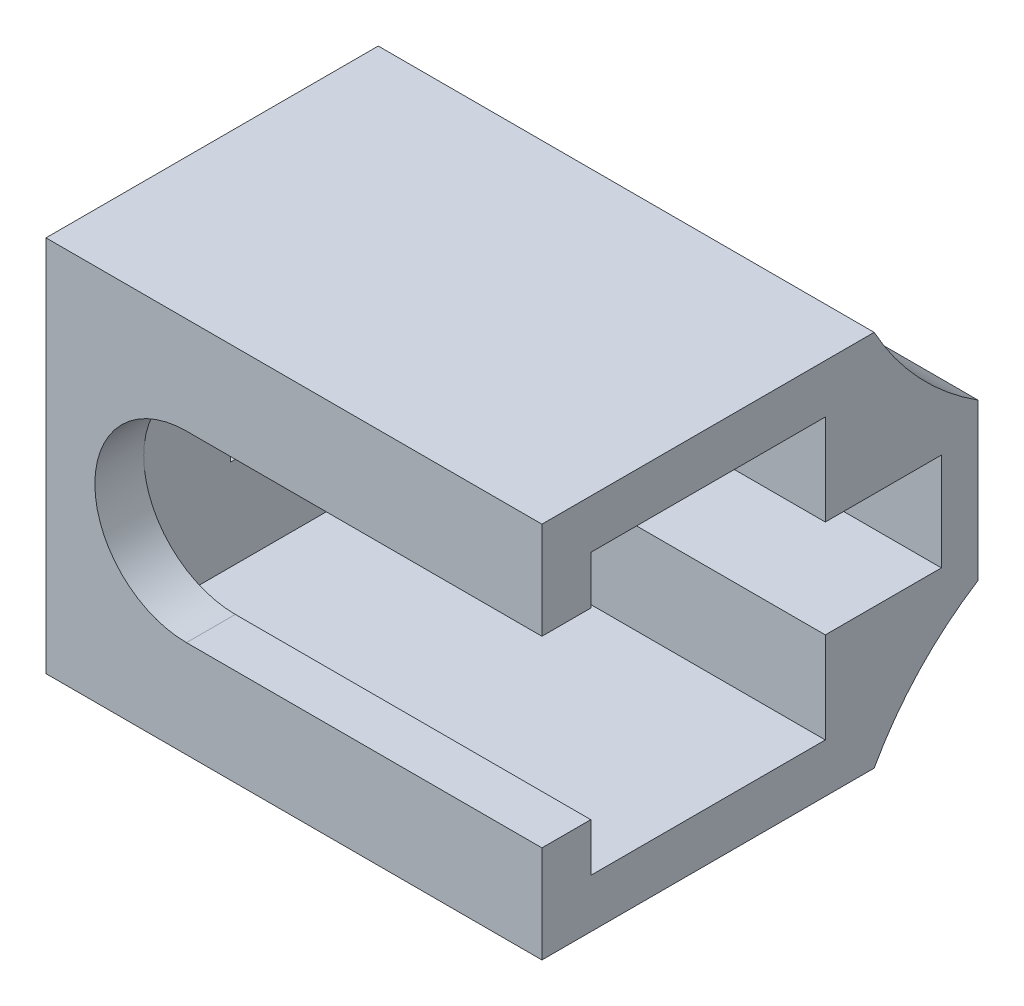
ISO-10303-21;
HEADER;
FILE_DESCRIPTION(('STEP AP214'),'2;1');
FILE_NAME('part.step','',(''),(''),'','','');
FILE_SCHEMA(('AUTOMOTIVE_DESIGN { 1 0 10303 214 1 1 1 1 }'));
ENDSEC;
DATA;
#1=APPLICATION_CONTEXT('core data for automotive mechanical design processes');
#2=APPLICATION_PROTOCOL_DEFINITION('international standard','automotive_design',2000,#1);
#3=PRODUCT_CONTEXT('',#1,'mechanical');
#4=PRODUCT('Part','Part','',(#3));
#5=PRODUCT_RELATED_PRODUCT_CATEGORY('part','',(#4));
#6=PRODUCT_DEFINITION_FORMATION('','',#4);
#7=PRODUCT_DEFINITION_CONTEXT('part definition',#1,'design');
#8=PRODUCT_DEFINITION('design','',#6,#7);
#9=PRODUCT_DEFINITION_SHAPE('','',#8);
#10=(LENGTH_UNIT() NAMED_UNIT(*) SI_UNIT(.MILLI.,.METRE.));
#11=(NAMED_UNIT(*) PLANE_ANGLE_UNIT() SI_UNIT($,.RADIAN.));
#12=(NAMED_UNIT(*) SI_UNIT($,.STERADIAN.) SOLID_ANGLE_UNIT());
#13=UNCERTAINTY_MEASURE_WITH_UNIT(LENGTH_MEASURE(1.E-05),#10,'distance_accuracy_value','');
#14=(GEOMETRIC_REPRESENTATION_CONTEXT(3) GLOBAL_UNCERTAINTY_ASSIGNED_CONTEXT((#13)) GLOBAL_UNIT_ASSIGNED_CONTEXT((#10,
#11,#12)) REPRESENTATION_CONTEXT('',''));
#15=CARTESIAN_POINT('',(0.,0.,0.));
#16=DIRECTION('',(0.,0.,1.));
#17=DIRECTION('',(1.,0.,0.));
#18=AXIS2_PLACEMENT_3D('',#15,#16,#17);
#19=CARTESIAN_POINT('',(-57.5,2.5,-45.));
#20=DIRECTION('',(1.,0.,0.));
#21=DIRECTION('',(0.,0.,-1.));
#22=AXIS2_PLACEMENT_3D('',#19,#20,#21);
#23=PLANE('',#22);
#24=DIRECTION('',(0.,0.,-1.));
#25=VECTOR('',#24,1.);
#26=CARTESIAN_POINT('',(-57.5,4.00000000000001,52.1));
#27=LINE('',#26,#25);
#28=CARTESIAN_POINT('',(-57.5,4.00000000000001,57.1));
#29=VERTEX_POINT('',#28);
#30=CARTESIAN_POINT('',(-57.5,4.00000000000001,52.1));
#31=VERTEX_POINT('',#30);
#32=EDGE_CURVE('E294',#29,#31,#27,.T.);
#33=ORIENTED_EDGE('',*,*,#32,.F.);
#34=DIRECTION('',(0.,1.,0.));
#35=VECTOR('',#34,1.);
#36=CARTESIAN_POINT('',(-57.5,4.00000000000001,57.1));
#37=LINE('',#36,#35);
#38=CARTESIAN_POINT('',(-57.5,-3.99999999999999,57.1));
#39=VERTEX_POINT('',#38);
#40=EDGE_CURVE('E291',#39,#29,#37,.T.);
#41=ORIENTED_EDGE('',*,*,#40,.F.);
#42=DIRECTION('',(0.,0.,1.));
#43=VECTOR('',#42,1.);
#44=CARTESIAN_POINT('',(-57.5,-3.99999999999999,52.1));
#45=LINE('',#44,#43);
#46=CARTESIAN_POINT('',(-57.5,-3.99999999999999,52.1));
#47=VERTEX_POINT('',#46);
#48=EDGE_CURVE('E302',#47,#39,#45,.T.);
#49=ORIENTED_EDGE('',*,*,#48,.F.);
#50=DIRECTION('',(0.,-1.,0.));
#51=VECTOR('',#50,1.);
#52=CARTESIAN_POINT('',(-57.5,4.00000000000001,52.1));
#53=LINE('',#52,#51);
#54=EDGE_CURVE('E298',#31,#47,#53,.T.);
#55=ORIENTED_EDGE('',*,*,#54,.F.);
#56=EDGE_LOOP('',(#33,#41,#49,#55));
#57=FACE_BOUND('',#56,.T.);
#58=CARTESIAN_POINT('',(-57.5,27.5,19.0957195963894));
#59=DIRECTION('',(1.,0.,0.));
#60=DIRECTION('',(0.,0.,-1.));
#61=AXIS2_PLACEMENT_3D('',#58,#59,#60);
#62=CIRCLE('',#61,25.);
#63=CARTESIAN_POINT('',(-57.5,15.45,41.));
#64=VERTEX_POINT('',#63);
#65=CARTESIAN_POINT('',(-57.5,6.39726873455995,32.5));
#66=VERTEX_POINT('',#65);
#67=EDGE_CURVE('E209',#64,#66,#62,.T.);
#68=ORIENTED_EDGE('',*,*,#67,.T.);
#69=DIRECTION('',(0.,-1.,0.));
#70=VECTOR('',#69,1.);
#71=CARTESIAN_POINT('',(-57.5,15.45,32.5));
#72=LINE('',#71,#70);
#73=CARTESIAN_POINT('',(-57.5,-6.39726873455994,32.5));
#74=VERTEX_POINT('',#73);
#75=EDGE_CURVE('E58',#66,#74,#72,.T.);
#76=ORIENTED_EDGE('',*,*,#75,.T.);
#77=CARTESIAN_POINT('',(-57.5,-27.5,19.0957195963894));
#78=DIRECTION('',(1.,0.,0.));
#79=DIRECTION('',(0.,0.,-1.));
#80=AXIS2_PLACEMENT_3D('',#77,#78,#79);
#81=CIRCLE('',#80,25.);
#82=CARTESIAN_POINT('',(-57.5,-15.45,41.));
#83=VERTEX_POINT('',#82);
#84=EDGE_CURVE('E206',#74,#83,#81,.T.);
#85=ORIENTED_EDGE('',*,*,#84,.T.);
#86=DIRECTION('',(0.,0.,1.));
#87=VECTOR('',#86,1.);
#88=CARTESIAN_POINT('',(-57.5,-15.45,41.));
#89=LINE('',#88,#87);
#90=CARTESIAN_POINT('',(-57.5,-15.45,68.2));
#91=VERTEX_POINT('',#90);
#92=EDGE_CURVE('E388',#83,#91,#89,.T.);
#93=ORIENTED_EDGE('',*,*,#92,.T.);
#94=DIRECTION('',(0.,1.,0.));
#95=VECTOR('',#94,1.);
#96=CARTESIAN_POINT('',(-57.5,15.45,68.2));
#97=LINE('',#96,#95);
#98=CARTESIAN_POINT('',(-57.5,15.45,68.2));
#99=VERTEX_POINT('',#98);
#100=EDGE_CURVE('E377',#91,#99,#97,.T.);
#101=ORIENTED_EDGE('',*,*,#100,.T.);
#102=DIRECTION('',(0.,0.,-1.));
#103=VECTOR('',#102,1.);
#104=CARTESIAN_POINT('',(-57.5,15.45,41.));
#105=LINE('',#104,#103);
#106=EDGE_CURVE('E361',#99,#64,#105,.T.);
#107=ORIENTED_EDGE('',*,*,#106,.T.);
#108=EDGE_LOOP('',(#68,#76,#85,#93,#101,#107));
#109=FACE_BOUND('',#108,.T.);
#110=ADVANCED_FACE('F42',(#57,#109),#23,.F.);
#111=CARTESIAN_POINT('',(-16.9,11.45,64.2));
#112=DIRECTION('',(0.,0.,1.));
#113=DIRECTION('',(1.,0.,0.));
#114=AXIS2_PLACEMENT_3D('',#111,#112,#113);
#115=PLANE('',#114);
#116=CARTESIAN_POINT('',(-46.,0.,64.2));
#117=DIRECTION('',(0.,0.,1.));
#118=DIRECTION('',(1.,0.,0.));
#119=AXIS2_PLACEMENT_3D('',#116,#117,#118);
#120=CIRCLE('',#119,7.5);
#121=CARTESIAN_POINT('',(-46.,-7.5,64.2));
#122=VERTEX_POINT('',#121);
#123=CARTESIAN_POINT('',(-53.5,0.,64.2));
#124=VERTEX_POINT('',#123);
#125=EDGE_CURVE('E682',#122,#124,#120,.F.);
#126=ORIENTED_EDGE('',*,*,#125,.F.);
#127=DIRECTION('',(-1.,0.,0.));
#128=VECTOR('',#127,1.);
#129=CARTESIAN_POINT('',(-46.,-7.5,64.2));
#130=LINE('',#129,#128);
#131=CARTESIAN_POINT('',(-16.9,-7.5,64.2));
#132=VERTEX_POINT('',#131);
#133=EDGE_CURVE('E688',#132,#122,#130,.T.);
#134=ORIENTED_EDGE('',*,*,#133,.F.);
#135=DIRECTION('',(0.,1.,0.));
#136=VECTOR('',#135,1.);
#137=CARTESIAN_POINT('',(-16.9,11.45,64.2));
#138=LINE('',#137,#136);
#139=CARTESIAN_POINT('',(-16.9,-11.45,64.2));
#140=VERTEX_POINT('',#139);
#141=EDGE_CURVE('E348',#140,#132,#138,.T.);
#142=ORIENTED_EDGE('',*,*,#141,.F.);
#143=DIRECTION('',(-1.,0.,0.));
#144=VECTOR('',#143,1.);
#145=CARTESIAN_POINT('',(-16.9,-11.45,64.2));
#146=LINE('',#145,#144);
#147=CARTESIAN_POINT('',(-53.5,-11.45,64.2));
#148=VERTEX_POINT('',#147);
#149=EDGE_CURVE('E366',#140,#148,#146,.T.);
#150=ORIENTED_EDGE('',*,*,#149,.T.);
#151=DIRECTION('',(0.,1.,0.));
#152=VECTOR('',#151,1.);
#153=CARTESIAN_POINT('',(-53.5,-11.45,64.2));
#154=LINE('',#153,#152);
#155=EDGE_CURVE('E331',#148,#124,#154,.T.);
#156=ORIENTED_EDGE('',*,*,#155,.T.);
#157=EDGE_LOOP('',(#126,#134,#142,#150,#156));
#158=FACE_BOUND('',#157,.T.);
#159=ADVANCED_FACE('F422',(#158),#115,.F.);
#160=CARTESIAN_POINT('',(-53.5,0.,0.));
#161=DIRECTION('',(-1.,0.,0.));
#162=DIRECTION('',(0.,0.,1.));
#163=AXIS2_PLACEMENT_3D('',#160,#161,#162);
#164=PLANE('',#163);
#165=DIRECTION('',(0.,-1.,0.));
#166=VECTOR('',#165,1.);
#167=CARTESIAN_POINT('',(-53.5,11.45,45.));
#168=LINE('',#167,#166);
#169=CARTESIAN_POINT('',(-53.5,11.45,45.));
#170=VERTEX_POINT('',#169);
#171=CARTESIAN_POINT('',(-53.5,-11.45,45.));
#172=VERTEX_POINT('',#171);
#173=EDGE_CURVE('E323',#170,#172,#168,.T.);
#174=ORIENTED_EDGE('',*,*,#173,.F.);
#175=DIRECTION('',(0.,0.,-1.));
#176=VECTOR('',#175,1.);
#177=CARTESIAN_POINT('',(-53.5,11.45,64.2));
#178=LINE('',#177,#176);
#179=CARTESIAN_POINT('',(-53.5,11.45,64.2));
#180=VERTEX_POINT('',#179);
#181=EDGE_CURVE('E335',#180,#170,#178,.T.);
#182=ORIENTED_EDGE('',*,*,#181,.F.);
#183=EDGE_CURVE('E330',#124,#180,#154,.T.);
#184=ORIENTED_EDGE('',*,*,#183,.F.);
#185=ORIENTED_EDGE('',*,*,#155,.F.);
#186=DIRECTION('',(0.,0.,1.));
#187=VECTOR('',#186,1.);
#188=CARTESIAN_POINT('',(-53.5,-11.45,45.));
#189=LINE('',#188,#187);
#190=EDGE_CURVE('E327',#172,#148,#189,.T.);
#191=ORIENTED_EDGE('',*,*,#190,.F.);
#192=EDGE_LOOP('',(#174,#182,#184,#185,#191));
#193=FACE_BOUND('',#192,.T.);
#194=DIRECTION('',(0.,0.,1.));
#195=VECTOR('',#194,1.);
#196=CARTESIAN_POINT('',(-53.5,4.00000000000001,52.1));
#197=LINE('',#196,#195);
#198=CARTESIAN_POINT('',(-53.5,4.00000000000001,52.1));
#199=VERTEX_POINT('',#198);
#200=CARTESIAN_POINT('',(-53.5,4.00000000000001,57.1));
#201=VERTEX_POINT('',#200);
#202=EDGE_CURVE('E310',#199,#201,#197,.T.);
#203=ORIENTED_EDGE('',*,*,#202,.F.);
#204=DIRECTION('',(0.,1.,0.));
#205=VECTOR('',#204,1.);
#206=CARTESIAN_POINT('',(-53.5,4.00000000000001,52.1));
#207=LINE('',#206,#205);
#208=CARTESIAN_POINT('',(-53.5,-3.99999999999999,52.1));
#209=VERTEX_POINT('',#208);
#210=EDGE_CURVE('E280',#209,#199,#207,.T.);
#211=ORIENTED_EDGE('',*,*,#210,.F.);
#212=DIRECTION('',(0.,0.,-1.));
#213=VECTOR('',#212,1.);
#214=CARTESIAN_POINT('',(-53.5,-3.99999999999999,52.1));
#215=LINE('',#214,#213);
#216=CARTESIAN_POINT('',(-53.5,-3.99999999999999,57.1));
#217=VERTEX_POINT('',#216);
#218=EDGE_CURVE('E284',#217,#209,#215,.T.);
#219=ORIENTED_EDGE('',*,*,#218,.F.);
#220=DIRECTION('',(0.,-1.,0.));
#221=VECTOR('',#220,1.);
#222=CARTESIAN_POINT('',(-53.5,4.00000000000001,57.1));
#223=LINE('',#222,#221);
#224=EDGE_CURVE('E287',#201,#217,#223,.T.);
#225=ORIENTED_EDGE('',*,*,#224,.F.);
#226=EDGE_LOOP('',(#203,#211,#219,#225));
#227=FACE_BOUND('',#226,.T.);
#228=ADVANCED_FACE('F429',(#193,#227),#164,.F.);
#229=CARTESIAN_POINT('',(-57.5,2.5,45.));
#230=DIRECTION('',(0.,0.,-1.));
#231=DIRECTION('',(-1.,0.,0.));
#232=AXIS2_PLACEMENT_3D('',#229,#230,#231);
#233=PLANE('',#232);
#234=DIRECTION('',(0.,1.,0.));
#235=VECTOR('',#234,1.);
#236=CARTESIAN_POINT('',(-48.5,2.5,45.));
#237=LINE('',#236,#235);
#238=CARTESIAN_POINT('',(-48.5,-4.,45.));
#239=VERTEX_POINT('',#238);
#240=CARTESIAN_POINT('',(-48.5,4.,45.));
#241=VERTEX_POINT('',#240);
#242=EDGE_CURVE('E276',#239,#241,#237,.T.);
#243=ORIENTED_EDGE('',*,*,#242,.T.);
#244=DIRECTION('',(1.,0.,0.));
#245=VECTOR('',#244,1.);
#246=CARTESIAN_POINT('',(-57.5,4.,45.));
#247=LINE('',#246,#245);
#248=CARTESIAN_POINT('',(-16.9,4.,45.));
#249=VERTEX_POINT('',#248);
#250=EDGE_CURVE('E272',#241,#249,#247,.T.);
#251=ORIENTED_EDGE('',*,*,#250,.T.);
#252=DIRECTION('',(0.,-1.,0.));
#253=VECTOR('',#252,1.);
#254=CARTESIAN_POINT('',(-16.9,11.45,45.));
#255=LINE('',#254,#253);
#256=CARTESIAN_POINT('',(-16.9,11.45,45.));
#257=VERTEX_POINT('',#256);
#258=EDGE_CURVE('E339',#257,#249,#255,.T.);
#259=ORIENTED_EDGE('',*,*,#258,.F.);
#260=DIRECTION('',(-1.,0.,0.));
#261=VECTOR('',#260,1.);
#262=CARTESIAN_POINT('',(-16.9,11.45,45.));
#263=LINE('',#262,#261);
#264=EDGE_CURVE('E357',#257,#170,#263,.T.);
#265=ORIENTED_EDGE('',*,*,#264,.T.);
#266=ORIENTED_EDGE('',*,*,#173,.T.);
#267=DIRECTION('',(-1.,0.,0.));
#268=VECTOR('',#267,1.);
#269=CARTESIAN_POINT('',(-16.9,-11.45,45.));
#270=LINE('',#269,#268);
#271=CARTESIAN_POINT('',(-16.9,-11.45,45.));
#272=VERTEX_POINT('',#271);
#273=EDGE_CURVE('E356',#272,#172,#270,.T.);
#274=ORIENTED_EDGE('',*,*,#273,.F.);
#275=CARTESIAN_POINT('',(-16.9,-4.,45.));
#276=VERTEX_POINT('',#275);
#277=EDGE_CURVE('E338',#276,#272,#255,.T.);
#278=ORIENTED_EDGE('',*,*,#277,.F.);
#279=DIRECTION('',(-1.,0.,0.));
#280=VECTOR('',#279,1.);
#281=CARTESIAN_POINT('',(-57.5,-4.,45.));
#282=LINE('',#281,#280);
#283=EDGE_CURVE('E248',#276,#239,#282,.T.);
#284=ORIENTED_EDGE('',*,*,#283,.T.);
#285=EDGE_LOOP('',(#243,#251,#259,#265,#266,#274,#278,#284));
#286=FACE_BOUND('',#285,.T.);
#287=ADVANCED_FACE('F435',(#286),#233,.F.);
#288=CARTESIAN_POINT('',(-16.9,11.45,45.));
#289=DIRECTION('',(0.,1.,0.));
#290=DIRECTION('',(0.,0.,1.));
#291=AXIS2_PLACEMENT_3D('',#288,#289,#290);
#292=PLANE('',#291);
#293=ORIENTED_EDGE('',*,*,#181,.T.);
#294=ORIENTED_EDGE('',*,*,#264,.F.);
#295=DIRECTION('',(0.,0.,-1.));
#296=VECTOR('',#295,1.);
#297=CARTESIAN_POINT('',(-16.9,11.45,45.));
#298=LINE('',#297,#296);
#299=CARTESIAN_POINT('',(-16.9,11.45,64.2));
#300=VERTEX_POINT('',#299);
#301=EDGE_CURVE('E352',#300,#257,#298,.T.);
#302=ORIENTED_EDGE('',*,*,#301,.F.);
#303=DIRECTION('',(-1.,0.,0.));
#304=VECTOR('',#303,1.);
#305=CARTESIAN_POINT('',(-16.9,11.45,64.2));
#306=LINE('',#305,#304);
#307=EDGE_CURVE('E362',#300,#180,#306,.T.);
#308=ORIENTED_EDGE('',*,*,#307,.T.);
#309=EDGE_LOOP('',(#293,#294,#302,#308));
#310=FACE_BOUND('',#309,.T.);
#311=ADVANCED_FACE('F438',(#310),#292,.F.);
#312=CARTESIAN_POINT('',(-16.9,7.5,64.2));
#313=VERTEX_POINT('',#312);
#314=EDGE_CURVE('E347',#313,#300,#138,.T.);
#315=ORIENTED_EDGE('',*,*,#314,.F.);
#316=DIRECTION('',(1.,0.,0.));
#317=VECTOR('',#316,1.);
#318=CARTESIAN_POINT('',(-46.,7.5,64.2));
#319=LINE('',#318,#317);
#320=CARTESIAN_POINT('',(-46.,7.5,64.2));
#321=VERTEX_POINT('',#320);
#322=EDGE_CURVE('E677',#321,#313,#319,.T.);
#323=ORIENTED_EDGE('',*,*,#322,.F.);
#324=EDGE_CURVE('E706',#124,#321,#120,.F.);
#325=ORIENTED_EDGE('',*,*,#324,.F.);
#326=ORIENTED_EDGE('',*,*,#183,.T.);
#327=ORIENTED_EDGE('',*,*,#307,.F.);
#328=EDGE_LOOP('',(#315,#323,#325,#326,#327));
#329=FACE_BOUND('',#328,.T.);
#330=ADVANCED_FACE('F432',(#329),#115,.F.);
#331=CARTESIAN_POINT('',(-16.9,-11.45,45.));
#332=DIRECTION('',(0.,-1.,0.));
#333=DIRECTION('',(0.,0.,-1.));
#334=AXIS2_PLACEMENT_3D('',#331,#332,#333);
#335=PLANE('',#334);
#336=ORIENTED_EDGE('',*,*,#190,.T.);
#337=ORIENTED_EDGE('',*,*,#149,.F.);
#338=DIRECTION('',(0.,0.,1.));
#339=VECTOR('',#338,1.);
#340=CARTESIAN_POINT('',(-16.9,-11.45,45.));
#341=LINE('',#340,#339);
#342=EDGE_CURVE('E343',#272,#140,#341,.T.);
#343=ORIENTED_EDGE('',*,*,#342,.F.);
#344=ORIENTED_EDGE('',*,*,#273,.T.);
#345=EDGE_LOOP('',(#336,#337,#343,#344));
#346=FACE_BOUND('',#345,.T.);
#347=ADVANCED_FACE('F442',(#346),#335,.F.);
#348=CARTESIAN_POINT('',(-16.9,15.45,41.));
#349=DIRECTION('',(0.,1.,0.));
#350=DIRECTION('',(0.,0.,1.));
#351=AXIS2_PLACEMENT_3D('',#348,#349,#350);
#352=PLANE('',#351);
#353=ORIENTED_EDGE('',*,*,#106,.F.);
#354=DIRECTION('',(-1.,0.,0.));
#355=VECTOR('',#354,1.);
#356=CARTESIAN_POINT('',(-16.9,15.45,68.2));
#357=LINE('',#356,#355);
#358=CARTESIAN_POINT('',(-16.9,15.45,68.2));
#359=VERTEX_POINT('',#358);
#360=EDGE_CURVE('E217',#359,#99,#357,.T.);
#361=ORIENTED_EDGE('',*,*,#360,.F.);
#362=DIRECTION('',(0.,0.,-1.));
#363=VECTOR('',#362,1.);
#364=CARTESIAN_POINT('',(-16.9,15.45,41.));
#365=LINE('',#364,#363);
#366=CARTESIAN_POINT('',(-16.9,15.45,41.));
#367=VERTEX_POINT('',#366);
#368=EDGE_CURVE('E372',#359,#367,#365,.T.);
#369=ORIENTED_EDGE('',*,*,#368,.T.);
#370=DIRECTION('',(-1.,0.,0.));
#371=VECTOR('',#370,1.);
#372=CARTESIAN_POINT('',(-16.9,15.45,41.));
#373=LINE('',#372,#371);
#374=EDGE_CURVE('E225',#367,#64,#373,.T.);
#375=ORIENTED_EDGE('',*,*,#374,.T.);
#376=EDGE_LOOP('',(#353,#361,#369,#375));
#377=FACE_BOUND('',#376,.T.);
#378=ADVANCED_FACE('F401',(#377),#352,.T.);
#379=CARTESIAN_POINT('',(-16.9,15.45,68.2));
#380=DIRECTION('',(0.,0.,1.));
#381=DIRECTION('',(1.,0.,0.));
#382=AXIS2_PLACEMENT_3D('',#379,#380,#381);
#383=PLANE('',#382);
#384=DIRECTION('',(1.,0.,0.));
#385=VECTOR('',#384,1.);
#386=CARTESIAN_POINT('',(-46.,-7.5,68.2));
#387=LINE('',#386,#385);
#388=CARTESIAN_POINT('',(-46.,-7.5,68.2));
#389=VERTEX_POINT('',#388);
#390=CARTESIAN_POINT('',(-16.9,-7.5,68.2));
#391=VERTEX_POINT('',#390);
#392=EDGE_CURVE('E65',#389,#391,#387,.T.);
#393=ORIENTED_EDGE('',*,*,#392,.F.);
#394=CARTESIAN_POINT('',(-46.,0.,68.2));
#395=DIRECTION('',(0.,0.,1.));
#396=DIRECTION('',(1.,0.,0.));
#397=AXIS2_PLACEMENT_3D('',#394,#395,#396);
#398=CIRCLE('',#397,7.5);
#399=CARTESIAN_POINT('',(-46.,7.5,68.2));
#400=VERTEX_POINT('',#399);
#401=EDGE_CURVE('E675',#400,#389,#398,.T.);
#402=ORIENTED_EDGE('',*,*,#401,.F.);
#403=DIRECTION('',(-1.,0.,0.));
#404=VECTOR('',#403,1.);
#405=CARTESIAN_POINT('',(-46.,7.5,68.2));
#406=LINE('',#405,#404);
#407=CARTESIAN_POINT('',(-16.9,7.5,68.2));
#408=VERTEX_POINT('',#407);
#409=EDGE_CURVE('E666',#408,#400,#406,.T.);
#410=ORIENTED_EDGE('',*,*,#409,.F.);
#411=DIRECTION('',(0.,1.,0.));
#412=VECTOR('',#411,1.);
#413=CARTESIAN_POINT('',(-16.9,15.45,68.2));
#414=LINE('',#413,#412);
#415=EDGE_CURVE('E381',#408,#359,#414,.T.);
#416=ORIENTED_EDGE('',*,*,#415,.T.);
#417=ORIENTED_EDGE('',*,*,#360,.T.);
#418=ORIENTED_EDGE('',*,*,#100,.F.);
#419=DIRECTION('',(-1.,0.,0.));
#420=VECTOR('',#419,1.);
#421=CARTESIAN_POINT('',(-16.9,-15.45,68.2));
#422=LINE('',#421,#420);
#423=CARTESIAN_POINT('',(-16.9,-15.45,68.2));
#424=VERTEX_POINT('',#423);
#425=EDGE_CURVE('E222',#424,#91,#422,.T.);
#426=ORIENTED_EDGE('',*,*,#425,.F.);
#427=EDGE_CURVE('E382',#424,#391,#414,.T.);
#428=ORIENTED_EDGE('',*,*,#427,.T.);
#429=EDGE_LOOP('',(#393,#402,#410,#416,#417,#418,#426,#428));
#430=FACE_BOUND('',#429,.T.);
#431=ADVANCED_FACE('F408',(#430),#383,.T.);
#432=CARTESIAN_POINT('',(-16.9,-15.45,41.));
#433=DIRECTION('',(0.,-1.,0.));
#434=DIRECTION('',(0.,0.,-1.));
#435=AXIS2_PLACEMENT_3D('',#432,#433,#434);
#436=PLANE('',#435);
#437=ORIENTED_EDGE('',*,*,#92,.F.);
#438=DIRECTION('',(-1.,0.,0.));
#439=VECTOR('',#438,1.);
#440=CARTESIAN_POINT('',(-16.9,-15.45,41.));
#441=LINE('',#440,#439);
#442=CARTESIAN_POINT('',(-16.9,-15.45,41.));
#443=VERTEX_POINT('',#442);
#444=EDGE_CURVE('E214',#443,#83,#441,.T.);
#445=ORIENTED_EDGE('',*,*,#444,.F.);
#446=DIRECTION('',(0.,0.,1.));
#447=VECTOR('',#446,1.);
#448=CARTESIAN_POINT('',(-16.9,-15.45,41.));
#449=LINE('',#448,#447);
#450=EDGE_CURVE('E376',#443,#424,#449,.T.);
#451=ORIENTED_EDGE('',*,*,#450,.T.);
#452=ORIENTED_EDGE('',*,*,#425,.T.);
#453=EDGE_LOOP('',(#437,#445,#451,#452));
#454=FACE_BOUND('',#453,.T.);
#455=ADVANCED_FACE('F443',(#454),#436,.T.);
#456=CARTESIAN_POINT('',(-16.9,0.,0.));
#457=DIRECTION('',(1.,0.,0.));
#458=DIRECTION('',(0.,0.,-1.));
#459=AXIS2_PLACEMENT_3D('',#456,#457,#458);
#460=PLANE('',#459);
#461=CARTESIAN_POINT('',(-16.9,-27.5,19.0957195963894));
#462=DIRECTION('',(1.,0.,0.));
#463=DIRECTION('',(0.,0.,-1.));
#464=AXIS2_PLACEMENT_3D('',#461,#462,#463);
#465=CIRCLE('',#464,25.);
#466=CARTESIAN_POINT('',(-16.9,-6.39726873455994,32.5));
#467=VERTEX_POINT('',#466);
#468=EDGE_CURVE('E216',#443,#467,#465,.F.);
#469=ORIENTED_EDGE('',*,*,#468,.T.);
#470=DIRECTION('',(0.,-1.,0.));
#471=VECTOR('',#470,1.);
#472=CARTESIAN_POINT('',(-16.9,0.,32.5));
#473=LINE('',#472,#471);
#474=CARTESIAN_POINT('',(-16.9,6.39726873455995,32.5));
#475=VERTEX_POINT('',#474);
#476=EDGE_CURVE('E195',#475,#467,#473,.T.);
#477=ORIENTED_EDGE('',*,*,#476,.F.);
#478=CARTESIAN_POINT('',(-16.9,27.5,19.0957195963894));
#479=DIRECTION('',(1.,0.,0.));
#480=DIRECTION('',(0.,0.,-1.));
#481=AXIS2_PLACEMENT_3D('',#478,#479,#480);
#482=CIRCLE('',#481,25.);
#483=EDGE_CURVE('E230',#475,#367,#482,.F.);
#484=ORIENTED_EDGE('',*,*,#483,.T.);
#485=ORIENTED_EDGE('',*,*,#368,.F.);
#486=ORIENTED_EDGE('',*,*,#415,.F.);
#487=DIRECTION('',(0.,0.,-1.));
#488=VECTOR('',#487,1.);
#489=CARTESIAN_POINT('',(-16.9,7.5,-45.001));
#490=LINE('',#489,#488);
#491=EDGE_CURVE('E670',#408,#313,#490,.T.);
#492=ORIENTED_EDGE('',*,*,#491,.T.);
#493=ORIENTED_EDGE('',*,*,#314,.T.);
#494=ORIENTED_EDGE('',*,*,#301,.T.);
#495=ORIENTED_EDGE('',*,*,#258,.T.);
#496=DIRECTION('',(0.,0.,1.));
#497=VECTOR('',#496,1.);
#498=CARTESIAN_POINT('',(-16.9,4.,0.));
#499=LINE('',#498,#497);
#500=CARTESIAN_POINT('',(-16.9,4.,35.5));
#501=VERTEX_POINT('',#500);
#502=EDGE_CURVE('E236',#501,#249,#499,.T.);
#503=ORIENTED_EDGE('',*,*,#502,.F.);
#504=DIRECTION('',(0.,1.,0.));
#505=VECTOR('',#504,1.);
#506=CARTESIAN_POINT('',(-16.9,0.,35.5));
#507=LINE('',#506,#505);
#508=CARTESIAN_POINT('',(-16.9,-4.,35.5));
#509=VERTEX_POINT('',#508);
#510=EDGE_CURVE('E233',#509,#501,#507,.T.);
#511=ORIENTED_EDGE('',*,*,#510,.F.);
#512=DIRECTION('',(0.,0.,-1.));
#513=VECTOR('',#512,1.);
#514=CARTESIAN_POINT('',(-16.9,-4.,0.));
#515=LINE('',#514,#513);
#516=EDGE_CURVE('E51',#276,#509,#515,.T.);
#517=ORIENTED_EDGE('',*,*,#516,.F.);
#518=ORIENTED_EDGE('',*,*,#277,.T.);
#519=ORIENTED_EDGE('',*,*,#342,.T.);
#520=ORIENTED_EDGE('',*,*,#141,.T.);
#521=DIRECTION('',(0.,0.,1.));
#522=VECTOR('',#521,1.);
#523=CARTESIAN_POINT('',(-16.9,-7.5,-45.001));
#524=LINE('',#523,#522);
#525=EDGE_CURVE('E201',#132,#391,#524,.T.);
#526=ORIENTED_EDGE('',*,*,#525,.T.);
#527=ORIENTED_EDGE('',*,*,#427,.F.);
#528=ORIENTED_EDGE('',*,*,#450,.F.);
#529=EDGE_LOOP('',(#469,#477,#484,#485,#486,#492,#493,#494,#495,#503,#511,#517,#518,#519,#520,
#526,#527,#528));
#530=FACE_BOUND('',#529,.T.);
#531=ADVANCED_FACE('F411',(#530),#460,.T.);
#532=CARTESIAN_POINT('',(57.501,4.00000000000001,57.1));
#533=DIRECTION('',(0.,0.,1.));
#534=DIRECTION('',(1.,0.,0.));
#535=AXIS2_PLACEMENT_3D('',#532,#533,#534);
#536=PLANE('',#535);
#537=ORIENTED_EDGE('',*,*,#224,.T.);
#538=DIRECTION('',(-1.,0.,0.));
#539=VECTOR('',#538,1.);
#540=CARTESIAN_POINT('',(57.501,-3.99999999999999,57.1));
#541=LINE('',#540,#539);
#542=EDGE_CURVE('E307',#217,#39,#541,.T.);
#543=ORIENTED_EDGE('',*,*,#542,.T.);
#544=ORIENTED_EDGE('',*,*,#40,.T.);
#545=DIRECTION('',(-1.,0.,0.));
#546=VECTOR('',#545,1.);
#547=CARTESIAN_POINT('',(57.501,4.00000000000001,57.1));
#548=LINE('',#547,#546);
#549=EDGE_CURVE('E306',#201,#29,#548,.T.);
#550=ORIENTED_EDGE('',*,*,#549,.F.);
#551=EDGE_LOOP('',(#537,#543,#544,#550));
#552=FACE_BOUND('',#551,.T.);
#553=ADVANCED_FACE('F451',(#552),#536,.F.);
#554=CARTESIAN_POINT('',(57.501,-3.99999999999999,52.1));
#555=DIRECTION('',(0.,-1.,0.));
#556=DIRECTION('',(0.,0.,-1.));
#557=AXIS2_PLACEMENT_3D('',#554,#555,#556);
#558=PLANE('',#557);
#559=ORIENTED_EDGE('',*,*,#218,.T.);
#560=DIRECTION('',(-1.,0.,0.));
#561=VECTOR('',#560,1.);
#562=CARTESIAN_POINT('',(57.501,-3.99999999999999,52.1));
#563=LINE('',#562,#561);
#564=EDGE_CURVE('E311',#209,#47,#563,.T.);
#565=ORIENTED_EDGE('',*,*,#564,.T.);
#566=ORIENTED_EDGE('',*,*,#48,.T.);
#567=ORIENTED_EDGE('',*,*,#542,.F.);
#568=EDGE_LOOP('',(#559,#565,#566,#567));
#569=FACE_BOUND('',#568,.T.);
#570=ADVANCED_FACE('F465',(#569),#558,.F.);
#571=CARTESIAN_POINT('',(57.501,4.00000000000001,52.1));
#572=DIRECTION('',(0.,0.,-1.));
#573=DIRECTION('',(-1.,0.,0.));
#574=AXIS2_PLACEMENT_3D('',#571,#572,#573);
#575=PLANE('',#574);
#576=ORIENTED_EDGE('',*,*,#210,.T.);
#577=DIRECTION('',(-1.,0.,0.));
#578=VECTOR('',#577,1.);
#579=CARTESIAN_POINT('',(57.501,4.00000000000001,52.1));
#580=LINE('',#579,#578);
#581=EDGE_CURVE('E314',#199,#31,#580,.T.);
#582=ORIENTED_EDGE('',*,*,#581,.T.);
#583=ORIENTED_EDGE('',*,*,#54,.T.);
#584=ORIENTED_EDGE('',*,*,#564,.F.);
#585=EDGE_LOOP('',(#576,#582,#583,#584));
#586=FACE_BOUND('',#585,.T.);
#587=ADVANCED_FACE('F469',(#586),#575,.F.);
#588=CARTESIAN_POINT('',(57.501,4.00000000000001,52.1));
#589=DIRECTION('',(0.,1.,0.));
#590=DIRECTION('',(0.,0.,1.));
#591=AXIS2_PLACEMENT_3D('',#588,#589,#590);
#592=PLANE('',#591);
#593=ORIENTED_EDGE('',*,*,#202,.T.);
#594=ORIENTED_EDGE('',*,*,#549,.T.);
#595=ORIENTED_EDGE('',*,*,#32,.T.);
#596=ORIENTED_EDGE('',*,*,#581,.F.);
#597=EDGE_LOOP('',(#593,#594,#595,#596));
#598=FACE_BOUND('',#597,.T.);
#599=ADVANCED_FACE('F420',(#598),#592,.F.);
#600=CARTESIAN_POINT('',(-16.9,-27.5,19.0957195963894));
#601=DIRECTION('',(-1.,0.,0.));
#602=DIRECTION('',(0.,0.,1.));
#603=AXIS2_PLACEMENT_3D('',#600,#601,#602);
#604=CYLINDRICAL_SURFACE('',#603,25.);
#605=ORIENTED_EDGE('',*,*,#84,.F.);
#606=DIRECTION('',(-1.,0.,0.));
#607=VECTOR('',#606,1.);
#608=CARTESIAN_POINT('',(-16.9,-6.39726873455994,32.5));
#609=LINE('',#608,#607);
#610=EDGE_CURVE('E192',#74,#467,#609,.F.);
#611=ORIENTED_EDGE('',*,*,#610,.T.);
#612=ORIENTED_EDGE('',*,*,#468,.F.);
#613=ORIENTED_EDGE('',*,*,#444,.T.);
#614=EDGE_LOOP('',(#605,#611,#612,#613));
#615=FACE_BOUND('',#614,.T.);
#616=ADVANCED_FACE('F213',(#615),#604,.F.);
#617=CARTESIAN_POINT('',(-16.9,27.5,19.0957195963894));
#618=DIRECTION('',(1.,0.,0.));
#619=DIRECTION('',(0.,0.,-1.));
#620=AXIS2_PLACEMENT_3D('',#617,#618,#619);
#621=CYLINDRICAL_SURFACE('',#620,25.);
#622=ORIENTED_EDGE('',*,*,#483,.F.);
#623=DIRECTION('',(1.,0.,0.));
#624=VECTOR('',#623,1.);
#625=CARTESIAN_POINT('',(-16.9,6.39726873455995,32.5));
#626=LINE('',#625,#624);
#627=EDGE_CURVE('E13',#475,#66,#626,.F.);
#628=ORIENTED_EDGE('',*,*,#627,.T.);
#629=ORIENTED_EDGE('',*,*,#67,.F.);
#630=ORIENTED_EDGE('',*,*,#374,.F.);
#631=EDGE_LOOP('',(#622,#628,#629,#630));
#632=FACE_BOUND('',#631,.T.);
#633=ADVANCED_FACE('F44',(#632),#621,.F.);
#634=CARTESIAN_POINT('',(-92.5287073831558,4.,35.5));
#635=DIRECTION('',(0.,0.,-1.));
#636=DIRECTION('',(0.,1.,0.));
#637=AXIS2_PLACEMENT_3D('',#634,#635,#636);
#638=PLANE('',#637);
#639=DIRECTION('',(1.,0.,0.));
#640=VECTOR('',#639,1.);
#641=CARTESIAN_POINT('',(-92.5287073831558,-4.,35.5));
#642=LINE('',#641,#640);
#643=CARTESIAN_POINT('',(-48.5,-4.,35.5));
#644=VERTEX_POINT('',#643);
#645=EDGE_CURVE('E246',#644,#509,#642,.T.);
#646=ORIENTED_EDGE('',*,*,#645,.T.);
#647=ORIENTED_EDGE('',*,*,#510,.T.);
#648=DIRECTION('',(1.,0.,0.));
#649=VECTOR('',#648,1.);
#650=CARTESIAN_POINT('',(-92.5287073831558,4.,35.5));
#651=LINE('',#650,#649);
#652=CARTESIAN_POINT('',(-48.5,4.,35.5));
#653=VERTEX_POINT('',#652);
#654=EDGE_CURVE('E263',#653,#501,#651,.T.);
#655=ORIENTED_EDGE('',*,*,#654,.F.);
#656=DIRECTION('',(0.,1.,0.));
#657=VECTOR('',#656,1.);
#658=CARTESIAN_POINT('',(-48.5,4.,35.5));
#659=LINE('',#658,#657);
#660=EDGE_CURVE('E257',#644,#653,#659,.T.);
#661=ORIENTED_EDGE('',*,*,#660,.F.);
#662=EDGE_LOOP('',(#646,#647,#655,#661));
#663=FACE_BOUND('',#662,.T.);
#664=ADVANCED_FACE('F253',(#663),#638,.F.);
#665=CARTESIAN_POINT('',(-92.5287073831558,-4.,73.7));
#666=DIRECTION('',(0.,-1.,0.));
#667=DIRECTION('',(0.,0.,-1.));
#668=AXIS2_PLACEMENT_3D('',#665,#666,#667);
#669=PLANE('',#668);
#670=ORIENTED_EDGE('',*,*,#516,.T.);
#671=ORIENTED_EDGE('',*,*,#645,.F.);
#672=DIRECTION('',(0.,0.,-1.));
#673=VECTOR('',#672,1.);
#674=CARTESIAN_POINT('',(-48.5,-4.,73.7));
#675=LINE('',#674,#673);
#676=EDGE_CURVE('E259',#239,#644,#675,.T.);
#677=ORIENTED_EDGE('',*,*,#676,.F.);
#678=ORIENTED_EDGE('',*,*,#283,.F.);
#679=EDGE_LOOP('',(#670,#671,#677,#678));
#680=FACE_BOUND('',#679,.T.);
#681=ADVANCED_FACE('F244',(#680),#669,.F.);
#682=CARTESIAN_POINT('',(-92.5287073831558,4.,73.7));
#683=DIRECTION('',(0.,1.,0.));
#684=DIRECTION('',(0.,0.,1.));
#685=AXIS2_PLACEMENT_3D('',#682,#683,#684);
#686=PLANE('',#685);
#687=DIRECTION('',(0.,0.,1.));
#688=VECTOR('',#687,1.);
#689=CARTESIAN_POINT('',(-48.5,4.,73.7));
#690=LINE('',#689,#688);
#691=EDGE_CURVE('E265',#653,#241,#690,.T.);
#692=ORIENTED_EDGE('',*,*,#691,.F.);
#693=ORIENTED_EDGE('',*,*,#654,.T.);
#694=ORIENTED_EDGE('',*,*,#502,.T.);
#695=ORIENTED_EDGE('',*,*,#250,.F.);
#696=EDGE_LOOP('',(#692,#693,#694,#695));
#697=FACE_BOUND('',#696,.T.);
#698=ADVANCED_FACE('F481',(#697),#686,.F.);
#699=CARTESIAN_POINT('',(-48.5,0.,0.));
#700=DIRECTION('',(-1.,0.,0.));
#701=DIRECTION('',(0.,0.,1.));
#702=AXIS2_PLACEMENT_3D('',#699,#700,#701);
#703=PLANE('',#702);
#704=ORIENTED_EDGE('',*,*,#676,.T.);
#705=ORIENTED_EDGE('',*,*,#660,.T.);
#706=ORIENTED_EDGE('',*,*,#691,.T.);
#707=ORIENTED_EDGE('',*,*,#242,.F.);
#708=EDGE_LOOP('',(#704,#705,#706,#707));
#709=FACE_BOUND('',#708,.T.);
#710=ADVANCED_FACE('F477',(#709),#703,.F.);
#711=CARTESIAN_POINT('',(-46.,-7.5,-45.001));
#712=DIRECTION('',(0.,-1.,0.));
#713=DIRECTION('',(0.,0.,-1.));
#714=AXIS2_PLACEMENT_3D('',#711,#712,#713);
#715=PLANE('',#714);
#716=ORIENTED_EDGE('',*,*,#133,.T.);
#717=DIRECTION('',(0.,0.,1.));
#718=VECTOR('',#717,1.);
#719=CARTESIAN_POINT('',(-46.,-7.5,-45.001));
#720=LINE('',#719,#718);
#721=EDGE_CURVE('E672',#122,#389,#720,.T.);
#722=ORIENTED_EDGE('',*,*,#721,.T.);
#723=ORIENTED_EDGE('',*,*,#392,.T.);
#724=ORIENTED_EDGE('',*,*,#525,.F.);
#725=EDGE_LOOP('',(#716,#722,#723,#724));
#726=FACE_BOUND('',#725,.T.);
#727=ADVANCED_FACE('F480',(#726),#715,.F.);
#728=CARTESIAN_POINT('',(-46.,7.5,-45.001));
#729=DIRECTION('',(0.,1.,0.));
#730=DIRECTION('',(0.,0.,1.));
#731=AXIS2_PLACEMENT_3D('',#728,#729,#730);
#732=PLANE('',#731);
#733=ORIENTED_EDGE('',*,*,#409,.T.);
#734=DIRECTION('',(0.,0.,1.));
#735=VECTOR('',#734,1.);
#736=CARTESIAN_POINT('',(-46.,7.5,-45.001));
#737=LINE('',#736,#735);
#738=EDGE_CURVE('E668',#321,#400,#737,.T.);
#739=ORIENTED_EDGE('',*,*,#738,.F.);
#740=ORIENTED_EDGE('',*,*,#322,.T.);
#741=ORIENTED_EDGE('',*,*,#491,.F.);
#742=EDGE_LOOP('',(#733,#739,#740,#741));
#743=FACE_BOUND('',#742,.T.);
#744=ADVANCED_FACE('F491',(#743),#732,.F.);
#745=CARTESIAN_POINT('',(-46.,0.,-45.001));
#746=DIRECTION('',(0.,0.,1.));
#747=DIRECTION('',(1.,0.,0.));
#748=AXIS2_PLACEMENT_3D('',#745,#746,#747);
#749=CYLINDRICAL_SURFACE('',#748,7.5);
#750=ORIENTED_EDGE('',*,*,#125,.T.);
#751=ORIENTED_EDGE('',*,*,#324,.T.);
#752=ORIENTED_EDGE('',*,*,#738,.T.);
#753=ORIENTED_EDGE('',*,*,#401,.T.);
#754=ORIENTED_EDGE('',*,*,#721,.F.);
#755=EDGE_LOOP('',(#750,#751,#752,#753,#754));
#756=FACE_BOUND('',#755,.T.);
#757=ADVANCED_FACE('F488',(#756),#749,.F.);
#758=CARTESIAN_POINT('',(-57.5,15.45,32.5));
#759=DIRECTION('',(0.,0.,1.));
#760=DIRECTION('',(0.,-1.,0.));
#761=AXIS2_PLACEMENT_3D('',#758,#759,#760);
#762=PLANE('',#761);
#763=ORIENTED_EDGE('',*,*,#476,.T.);
#764=ORIENTED_EDGE('',*,*,#610,.F.);
#765=ORIENTED_EDGE('',*,*,#75,.F.);
#766=ORIENTED_EDGE('',*,*,#627,.F.);
#767=EDGE_LOOP('',(#763,#764,#765,#766));
#768=FACE_BOUND('',#767,.T.);
#769=ADVANCED_FACE('F193',(#768),#762,.F.);
#770=CLOSED_SHELL('',(#110,#159,#228,#287,#311,#330,#347,#378,#431,#455,#531,#553,#570,#587,
#599,#616,#633,#664,#681,#698,#710,#727,#744,#757,#769));
#771=MANIFOLD_SOLID_BREP('B2',#770);
#772=ADVANCED_BREP_SHAPE_REPRESENTATION('',(#18,#771),#14);
#773=SHAPE_DEFINITION_REPRESENTATION(#9,#772);
ENDSEC;
END-ISO-10303-21;
